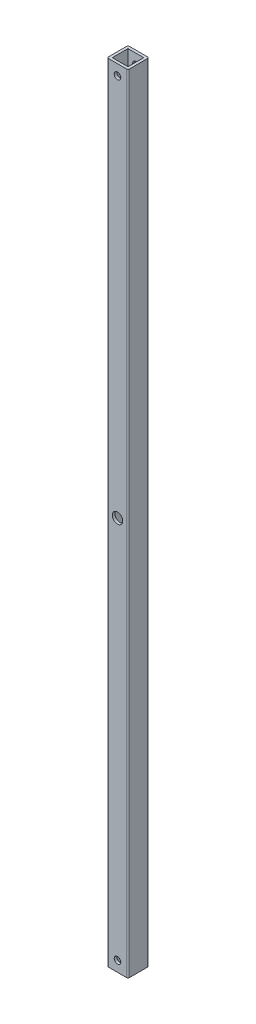
ISO-10303-21;
HEADER;
FILE_DESCRIPTION(('STEP AP214'),'2;1');
FILE_NAME('part.step','',(''),(''),'','','');
FILE_SCHEMA(('AUTOMOTIVE_DESIGN { 1 0 10303 214 1 1 1 1 }'));
ENDSEC;
DATA;
#1=APPLICATION_CONTEXT('core data for automotive mechanical design processes');
#2=APPLICATION_PROTOCOL_DEFINITION('international standard','automotive_design',2000,#1);
#3=PRODUCT_CONTEXT('',#1,'mechanical');
#4=PRODUCT('Part','Part','',(#3));
#5=PRODUCT_RELATED_PRODUCT_CATEGORY('part','',(#4));
#6=PRODUCT_DEFINITION_FORMATION('','',#4);
#7=PRODUCT_DEFINITION_CONTEXT('part definition',#1,'design');
#8=PRODUCT_DEFINITION('design','',#6,#7);
#9=PRODUCT_DEFINITION_SHAPE('','',#8);
#10=(LENGTH_UNIT() NAMED_UNIT(*) SI_UNIT(.MILLI.,.METRE.));
#11=(NAMED_UNIT(*) PLANE_ANGLE_UNIT() SI_UNIT($,.RADIAN.));
#12=(NAMED_UNIT(*) SI_UNIT($,.STERADIAN.) SOLID_ANGLE_UNIT());
#13=UNCERTAINTY_MEASURE_WITH_UNIT(LENGTH_MEASURE(1.E-05),#10,'distance_accuracy_value','');
#14=(GEOMETRIC_REPRESENTATION_CONTEXT(3) GLOBAL_UNCERTAINTY_ASSIGNED_CONTEXT((#13)) GLOBAL_UNIT_ASSIGNED_CONTEXT((#10,
#11,#12)) REPRESENTATION_CONTEXT('',''));
#15=CARTESIAN_POINT('',(0.,0.,0.));
#16=DIRECTION('',(0.,0.,1.));
#17=DIRECTION('',(1.,0.,0.));
#18=AXIS2_PLACEMENT_3D('',#15,#16,#17);
#19=CARTESIAN_POINT('',(0.,600.,0.));
#20=DIRECTION('',(0.,1.,0.));
#21=DIRECTION('',(0.,0.,1.));
#22=AXIS2_PLACEMENT_3D('',#19,#20,#21);
#23=PLANE('',#22);
#24=DIRECTION('',(0.,0.,-1.));
#25=VECTOR('',#24,1.);
#26=CARTESIAN_POINT('',(9.86111111111111,600.,-4.08333333333333));
#27=LINE('',#26,#25);
#28=CARTESIAN_POINT('',(9.86111111111112,600.,10.9166666666667));
#29=VERTEX_POINT('',#28);
#30=CARTESIAN_POINT('',(9.86111111111111,600.,-3.08333333333333));
#31=VERTEX_POINT('',#30);
#32=EDGE_CURVE('E188',#29,#31,#27,.T.);
#33=ORIENTED_EDGE('',*,*,#32,.T.);
#34=CARTESIAN_POINT('',(8.86111111111111,600.,-3.08333333333333));
#35=DIRECTION('',(0.,1.,0.));
#36=DIRECTION('',(0.,0.,1.));
#37=AXIS2_PLACEMENT_3D('',#34,#35,#36);
#38=CIRCLE('',#37,1.);
#39=CARTESIAN_POINT('',(8.86111111111111,600.,-4.08333333333333));
#40=VERTEX_POINT('',#39);
#41=EDGE_CURVE('E226',#31,#40,#38,.T.);
#42=ORIENTED_EDGE('',*,*,#41,.T.);
#43=DIRECTION('',(-1.,0.,0.));
#44=VECTOR('',#43,1.);
#45=CARTESIAN_POINT('',(-6.13888888888889,600.,-4.08333333333333));
#46=LINE('',#45,#44);
#47=CARTESIAN_POINT('',(-5.13888888888889,600.,-4.08333333333333));
#48=VERTEX_POINT('',#47);
#49=EDGE_CURVE('E191',#40,#48,#46,.T.);
#50=ORIENTED_EDGE('',*,*,#49,.T.);
#51=CARTESIAN_POINT('',(-5.13888888888889,600.,-3.08333333333333));
#52=DIRECTION('',(0.,1.,0.));
#53=DIRECTION('',(0.,0.,1.));
#54=AXIS2_PLACEMENT_3D('',#51,#52,#53);
#55=CIRCLE('',#54,1.);
#56=CARTESIAN_POINT('',(-6.13888888888889,600.,-3.08333333333333));
#57=VERTEX_POINT('',#56);
#58=EDGE_CURVE('E224',#48,#57,#55,.T.);
#59=ORIENTED_EDGE('',*,*,#58,.T.);
#60=DIRECTION('',(0.,0.,1.));
#61=VECTOR('',#60,1.);
#62=CARTESIAN_POINT('',(-6.13888888888889,600.,-4.08333333333333));
#63=LINE('',#62,#61);
#64=CARTESIAN_POINT('',(-6.13888888888889,600.,10.9166666666667));
#65=VERTEX_POINT('',#64);
#66=EDGE_CURVE('E183',#57,#65,#63,.T.);
#67=ORIENTED_EDGE('',*,*,#66,.T.);
#68=CARTESIAN_POINT('',(-5.13888888888889,600.,10.9166666666667));
#69=DIRECTION('',(0.,1.,0.));
#70=DIRECTION('',(0.,0.,1.));
#71=AXIS2_PLACEMENT_3D('',#68,#69,#70);
#72=CIRCLE('',#71,1.);
#73=CARTESIAN_POINT('',(-5.13888888888889,600.,11.9166666666667));
#74=VERTEX_POINT('',#73);
#75=EDGE_CURVE('E70',#65,#74,#72,.T.);
#76=ORIENTED_EDGE('',*,*,#75,.T.);
#77=DIRECTION('',(1.,0.,0.));
#78=VECTOR('',#77,1.);
#79=CARTESIAN_POINT('',(-6.13888888888889,600.,11.9166666666667));
#80=LINE('',#79,#78);
#81=CARTESIAN_POINT('',(8.86111111111111,600.,11.9166666666667));
#82=VERTEX_POINT('',#81);
#83=EDGE_CURVE('E185',#74,#82,#80,.T.);
#84=ORIENTED_EDGE('',*,*,#83,.T.);
#85=CARTESIAN_POINT('',(8.86111111111111,600.,10.9166666666667));
#86=DIRECTION('',(0.,1.,0.));
#87=DIRECTION('',(0.,0.,1.));
#88=AXIS2_PLACEMENT_3D('',#85,#86,#87);
#89=CIRCLE('',#88,1.);
#90=EDGE_CURVE('E221',#82,#29,#89,.T.);
#91=ORIENTED_EDGE('',*,*,#90,.T.);
#92=EDGE_LOOP('',(#33,#42,#50,#59,#67,#76,#84,#91));
#93=FACE_BOUND('',#92,.T.);
#94=DIRECTION('',(0.,0.,1.));
#95=VECTOR('',#94,1.);
#96=CARTESIAN_POINT('',(-4.13888888888889,600.,-2.08333333333333));
#97=LINE('',#96,#95);
#98=CARTESIAN_POINT('',(-4.13888888888889,600.,-2.08333333333333));
#99=VERTEX_POINT('',#98);
#100=CARTESIAN_POINT('',(-4.13888888888889,600.,9.91666666666667));
#101=VERTEX_POINT('',#100);
#102=EDGE_CURVE('E150',#99,#101,#97,.T.);
#103=ORIENTED_EDGE('',*,*,#102,.F.);
#104=DIRECTION('',(-1.,0.,0.));
#105=VECTOR('',#104,1.);
#106=CARTESIAN_POINT('',(-4.13888888888889,600.,-2.08333333333333));
#107=LINE('',#106,#105);
#108=CARTESIAN_POINT('',(7.86111111111111,600.,-2.08333333333333));
#109=VERTEX_POINT('',#108);
#110=EDGE_CURVE('E140',#109,#99,#107,.T.);
#111=ORIENTED_EDGE('',*,*,#110,.F.);
#112=DIRECTION('',(0.,0.,-1.));
#113=VECTOR('',#112,1.);
#114=CARTESIAN_POINT('',(7.86111111111111,600.,-2.08333333333333));
#115=LINE('',#114,#113);
#116=CARTESIAN_POINT('',(7.86111111111111,600.,9.91666666666667));
#117=VERTEX_POINT('',#116);
#118=EDGE_CURVE('E165',#117,#109,#115,.T.);
#119=ORIENTED_EDGE('',*,*,#118,.F.);
#120=DIRECTION('',(1.,0.,0.));
#121=VECTOR('',#120,1.);
#122=CARTESIAN_POINT('',(-4.13888888888889,600.,9.91666666666667));
#123=LINE('',#122,#121);
#124=EDGE_CURVE('E163',#101,#117,#123,.T.);
#125=ORIENTED_EDGE('',*,*,#124,.F.);
#126=EDGE_LOOP('',(#103,#111,#119,#125));
#127=FACE_BOUND('',#126,.T.);
#128=ADVANCED_FACE('F47',(#93,#127),#23,.T.);
#129=CARTESIAN_POINT('',(0.,0.,0.));
#130=DIRECTION('',(0.,1.,0.));
#131=DIRECTION('',(0.,0.,1.));
#132=AXIS2_PLACEMENT_3D('',#129,#130,#131);
#133=PLANE('',#132);
#134=DIRECTION('',(-1.,0.,0.));
#135=VECTOR('',#134,1.);
#136=CARTESIAN_POINT('',(-6.13888888888889,0.,-4.08333333333333));
#137=LINE('',#136,#135);
#138=CARTESIAN_POINT('',(8.86111111111111,0.,-4.08333333333333));
#139=VERTEX_POINT('',#138);
#140=CARTESIAN_POINT('',(-5.13888888888889,0.,-4.08333333333333));
#141=VERTEX_POINT('',#140);
#142=EDGE_CURVE('E186',#139,#141,#137,.T.);
#143=ORIENTED_EDGE('',*,*,#142,.F.);
#144=CARTESIAN_POINT('',(8.86111111111111,0.,-3.08333333333333));
#145=DIRECTION('',(0.,1.,0.));
#146=DIRECTION('',(0.,0.,1.));
#147=AXIS2_PLACEMENT_3D('',#144,#145,#146);
#148=CIRCLE('',#147,1.);
#149=CARTESIAN_POINT('',(9.86111111111111,0.,-3.08333333333333));
#150=VERTEX_POINT('',#149);
#151=EDGE_CURVE('E214',#139,#150,#148,.F.);
#152=ORIENTED_EDGE('',*,*,#151,.T.);
#153=DIRECTION('',(0.,0.,-1.));
#154=VECTOR('',#153,1.);
#155=CARTESIAN_POINT('',(9.86111111111111,0.,-4.08333333333333));
#156=LINE('',#155,#154);
#157=CARTESIAN_POINT('',(9.86111111111112,0.,10.9166666666667));
#158=VERTEX_POINT('',#157);
#159=EDGE_CURVE('E199',#158,#150,#156,.T.);
#160=ORIENTED_EDGE('',*,*,#159,.F.);
#161=CARTESIAN_POINT('',(8.86111111111111,0.,10.9166666666667));
#162=DIRECTION('',(0.,1.,0.));
#163=DIRECTION('',(0.,0.,1.));
#164=AXIS2_PLACEMENT_3D('',#161,#162,#163);
#165=CIRCLE('',#164,1.);
#166=CARTESIAN_POINT('',(8.86111111111111,0.,11.9166666666667));
#167=VERTEX_POINT('',#166);
#168=EDGE_CURVE('E208',#158,#167,#165,.F.);
#169=ORIENTED_EDGE('',*,*,#168,.T.);
#170=DIRECTION('',(1.,0.,0.));
#171=VECTOR('',#170,1.);
#172=CARTESIAN_POINT('',(-6.13888888888889,0.,11.9166666666667));
#173=LINE('',#172,#171);
#174=CARTESIAN_POINT('',(-5.13888888888889,0.,11.9166666666667));
#175=VERTEX_POINT('',#174);
#176=EDGE_CURVE('E197',#175,#167,#173,.T.);
#177=ORIENTED_EDGE('',*,*,#176,.F.);
#178=CARTESIAN_POINT('',(-5.13888888888889,0.,10.9166666666667));
#179=DIRECTION('',(0.,1.,0.));
#180=DIRECTION('',(0.,0.,1.));
#181=AXIS2_PLACEMENT_3D('',#178,#179,#180);
#182=CIRCLE('',#181,1.);
#183=CARTESIAN_POINT('',(-6.13888888888889,0.,10.9166666666667));
#184=VERTEX_POINT('',#183);
#185=EDGE_CURVE('E210',#175,#184,#182,.F.);
#186=ORIENTED_EDGE('',*,*,#185,.T.);
#187=DIRECTION('',(0.,0.,1.));
#188=VECTOR('',#187,1.);
#189=CARTESIAN_POINT('',(-6.13888888888889,0.,-4.08333333333333));
#190=LINE('',#189,#188);
#191=CARTESIAN_POINT('',(-6.13888888888889,0.,-3.08333333333333));
#192=VERTEX_POINT('',#191);
#193=EDGE_CURVE('E158',#192,#184,#190,.T.);
#194=ORIENTED_EDGE('',*,*,#193,.F.);
#195=CARTESIAN_POINT('',(-5.13888888888889,0.,-3.08333333333333));
#196=DIRECTION('',(0.,1.,0.));
#197=DIRECTION('',(0.,0.,1.));
#198=AXIS2_PLACEMENT_3D('',#195,#196,#197);
#199=CIRCLE('',#198,1.);
#200=EDGE_CURVE('E212',#192,#141,#199,.F.);
#201=ORIENTED_EDGE('',*,*,#200,.T.);
#202=EDGE_LOOP('',(#143,#152,#160,#169,#177,#186,#194,#201));
#203=FACE_BOUND('',#202,.T.);
#204=DIRECTION('',(-1.,0.,0.));
#205=VECTOR('',#204,1.);
#206=CARTESIAN_POINT('',(-4.13888888888889,0.,-2.08333333333333));
#207=LINE('',#206,#205);
#208=CARTESIAN_POINT('',(7.86111111111111,0.,-2.08333333333333));
#209=VERTEX_POINT('',#208);
#210=CARTESIAN_POINT('',(-4.13888888888889,0.,-2.08333333333333));
#211=VERTEX_POINT('',#210);
#212=EDGE_CURVE('E170',#209,#211,#207,.T.);
#213=ORIENTED_EDGE('',*,*,#212,.T.);
#214=DIRECTION('',(0.,0.,1.));
#215=VECTOR('',#214,1.);
#216=CARTESIAN_POINT('',(-4.13888888888889,0.,-2.08333333333333));
#217=LINE('',#216,#215);
#218=CARTESIAN_POINT('',(-4.13888888888889,0.,9.91666666666667));
#219=VERTEX_POINT('',#218);
#220=EDGE_CURVE('E157',#211,#219,#217,.T.);
#221=ORIENTED_EDGE('',*,*,#220,.T.);
#222=DIRECTION('',(1.,0.,0.));
#223=VECTOR('',#222,1.);
#224=CARTESIAN_POINT('',(-4.13888888888889,0.,9.91666666666667));
#225=LINE('',#224,#223);
#226=CARTESIAN_POINT('',(7.86111111111111,0.,9.91666666666667));
#227=VERTEX_POINT('',#226);
#228=EDGE_CURVE('E174',#219,#227,#225,.T.);
#229=ORIENTED_EDGE('',*,*,#228,.T.);
#230=DIRECTION('',(0.,0.,-1.));
#231=VECTOR('',#230,1.);
#232=CARTESIAN_POINT('',(7.86111111111111,0.,-2.08333333333333));
#233=LINE('',#232,#231);
#234=EDGE_CURVE('E151',#227,#209,#233,.T.);
#235=ORIENTED_EDGE('',*,*,#234,.T.);
#236=EDGE_LOOP('',(#213,#221,#229,#235));
#237=FACE_BOUND('',#236,.T.);
#238=ADVANCED_FACE('F272',(#203,#237),#133,.F.);
#239=CARTESIAN_POINT('',(-6.13888888888889,600.,-4.08333333333333));
#240=DIRECTION('',(1.,0.,0.));
#241=DIRECTION('',(0.,0.,-1.));
#242=AXIS2_PLACEMENT_3D('',#239,#240,#241);
#243=PLANE('',#242);
#244=ORIENTED_EDGE('',*,*,#66,.F.);
#245=DIRECTION('',(0.,-1.,0.));
#246=VECTOR('',#245,1.);
#247=CARTESIAN_POINT('',(-6.13888888888889,600.,-3.08333333333333));
#248=LINE('',#247,#246);
#249=EDGE_CURVE('E230',#57,#192,#248,.T.);
#250=ORIENTED_EDGE('',*,*,#249,.T.);
#251=ORIENTED_EDGE('',*,*,#193,.T.);
#252=DIRECTION('',(0.,-1.,0.));
#253=VECTOR('',#252,1.);
#254=CARTESIAN_POINT('',(-6.13888888888889,600.,10.9166666666667));
#255=LINE('',#254,#253);
#256=EDGE_CURVE('E228',#184,#65,#255,.F.);
#257=ORIENTED_EDGE('',*,*,#256,.T.);
#258=EDGE_LOOP('',(#244,#250,#251,#257));
#259=FACE_BOUND('',#258,.T.);
#260=ADVANCED_FACE('F289',(#259),#243,.F.);
#261=CARTESIAN_POINT('',(-6.13888888888889,600.,11.9166666666667));
#262=DIRECTION('',(0.,0.,-1.));
#263=DIRECTION('',(-1.,0.,0.));
#264=AXIS2_PLACEMENT_3D('',#261,#262,#263);
#265=PLANE('',#264);
#266=CARTESIAN_POINT('',(1.86111111111111,8.,11.9166666666667));
#267=DIRECTION('',(0.,0.,-1.));
#268=DIRECTION('',(-1.,0.,0.));
#269=AXIS2_PLACEMENT_3D('',#266,#267,#268);
#270=CIRCLE('',#269,2.5);
#271=CARTESIAN_POINT('',(-0.638888888888889,8.,11.9166666666667));
#272=VERTEX_POINT('',#271);
#273=EDGE_CURVE('E237',#272,#272,#270,.T.);
#274=ORIENTED_EDGE('',*,*,#273,.T.);
#275=EDGE_LOOP('',(#274));
#276=FACE_BOUND('',#275,.T.);
#277=CARTESIAN_POINT('',(1.86111111111111,592.,11.9166666666667));
#278=DIRECTION('',(0.,0.,-1.));
#279=DIRECTION('',(-1.,0.,0.));
#280=AXIS2_PLACEMENT_3D('',#277,#278,#279);
#281=CIRCLE('',#280,2.5);
#282=CARTESIAN_POINT('',(-0.638888888888891,592.,11.9166666666667));
#283=VERTEX_POINT('',#282);
#284=EDGE_CURVE('E363',#283,#283,#281,.T.);
#285=ORIENTED_EDGE('',*,*,#284,.T.);
#286=EDGE_LOOP('',(#285));
#287=FACE_BOUND('',#286,.T.);
#288=CARTESIAN_POINT('',(1.86111111111111,300.,11.9166666666667));
#289=DIRECTION('',(0.,0.,-1.));
#290=DIRECTION('',(-1.,0.,0.));
#291=AXIS2_PLACEMENT_3D('',#288,#289,#290);
#292=CIRCLE('',#291,4.);
#293=CARTESIAN_POINT('',(-2.13888888888889,300.,11.9166666666667));
#294=VERTEX_POINT('',#293);
#295=EDGE_CURVE('E250',#294,#294,#292,.T.);
#296=ORIENTED_EDGE('',*,*,#295,.T.);
#297=EDGE_LOOP('',(#296));
#298=FACE_BOUND('',#297,.T.);
#299=ORIENTED_EDGE('',*,*,#83,.F.);
#300=DIRECTION('',(0.,-1.,0.));
#301=VECTOR('',#300,1.);
#302=CARTESIAN_POINT('',(-5.13888888888889,600.,11.9166666666667));
#303=LINE('',#302,#301);
#304=EDGE_CURVE('E11',#74,#175,#303,.T.);
#305=ORIENTED_EDGE('',*,*,#304,.T.);
#306=ORIENTED_EDGE('',*,*,#176,.T.);
#307=DIRECTION('',(0.,-1.,0.));
#308=VECTOR('',#307,1.);
#309=CARTESIAN_POINT('',(8.86111111111111,600.,11.9166666666667));
#310=LINE('',#309,#308);
#311=EDGE_CURVE('E56',#167,#82,#310,.F.);
#312=ORIENTED_EDGE('',*,*,#311,.T.);
#313=EDGE_LOOP('',(#299,#305,#306,#312));
#314=FACE_BOUND('',#313,.T.);
#315=ADVANCED_FACE('F302',(#276,#287,#298,#314),#265,.F.);
#316=CARTESIAN_POINT('',(9.86111111111111,600.,-4.08333333333333));
#317=DIRECTION('',(-1.,0.,0.));
#318=DIRECTION('',(0.,0.,1.));
#319=AXIS2_PLACEMENT_3D('',#316,#317,#318);
#320=PLANE('',#319);
#321=ORIENTED_EDGE('',*,*,#159,.T.);
#322=DIRECTION('',(0.,-1.,0.));
#323=VECTOR('',#322,1.);
#324=CARTESIAN_POINT('',(9.86111111111111,600.,-3.08333333333333));
#325=LINE('',#324,#323);
#326=EDGE_CURVE('E219',#150,#31,#325,.F.);
#327=ORIENTED_EDGE('',*,*,#326,.T.);
#328=ORIENTED_EDGE('',*,*,#32,.F.);
#329=DIRECTION('',(0.,-1.,0.));
#330=VECTOR('',#329,1.);
#331=CARTESIAN_POINT('',(9.86111111111112,600.,10.9166666666667));
#332=LINE('',#331,#330);
#333=EDGE_CURVE('E216',#29,#158,#332,.T.);
#334=ORIENTED_EDGE('',*,*,#333,.T.);
#335=EDGE_LOOP('',(#321,#327,#328,#334));
#336=FACE_BOUND('',#335,.T.);
#337=ADVANCED_FACE('F298',(#336),#320,.F.);
#338=CARTESIAN_POINT('',(-6.13888888888889,600.,-4.08333333333333));
#339=DIRECTION('',(0.,0.,1.));
#340=DIRECTION('',(1.,0.,0.));
#341=AXIS2_PLACEMENT_3D('',#338,#339,#340);
#342=PLANE('',#341);
#343=CARTESIAN_POINT('',(1.86111111111111,8.,-4.08333333333333));
#344=DIRECTION('',(0.,0.,-1.));
#345=DIRECTION('',(-1.,0.,0.));
#346=AXIS2_PLACEMENT_3D('',#343,#344,#345);
#347=CIRCLE('',#346,2.5);
#348=CARTESIAN_POINT('',(-0.638888888888889,8.,-4.08333333333333));
#349=VERTEX_POINT('',#348);
#350=EDGE_CURVE('E371',#349,#349,#347,.T.);
#351=ORIENTED_EDGE('',*,*,#350,.F.);
#352=EDGE_LOOP('',(#351));
#353=FACE_BOUND('',#352,.T.);
#354=CARTESIAN_POINT('',(1.86111111111111,592.,-4.08333333333333));
#355=DIRECTION('',(0.,0.,-1.));
#356=DIRECTION('',(-1.,0.,0.));
#357=AXIS2_PLACEMENT_3D('',#354,#355,#356);
#358=CIRCLE('',#357,2.5);
#359=CARTESIAN_POINT('',(-0.638888888888891,592.,-4.08333333333333));
#360=VERTEX_POINT('',#359);
#361=EDGE_CURVE('E365',#360,#360,#358,.T.);
#362=ORIENTED_EDGE('',*,*,#361,.F.);
#363=EDGE_LOOP('',(#362));
#364=FACE_BOUND('',#363,.T.);
#365=CARTESIAN_POINT('',(1.86111111111111,300.,-4.08333333333333));
#366=DIRECTION('',(0.,0.,-1.));
#367=DIRECTION('',(-1.,0.,0.));
#368=AXIS2_PLACEMENT_3D('',#365,#366,#367);
#369=CIRCLE('',#368,4.);
#370=CARTESIAN_POINT('',(-2.13888888888889,300.,-4.08333333333333));
#371=VERTEX_POINT('',#370);
#372=EDGE_CURVE('E361',#371,#371,#369,.T.);
#373=ORIENTED_EDGE('',*,*,#372,.F.);
#374=EDGE_LOOP('',(#373));
#375=FACE_BOUND('',#374,.T.);
#376=ORIENTED_EDGE('',*,*,#49,.F.);
#377=DIRECTION('',(0.,-1.,0.));
#378=VECTOR('',#377,1.);
#379=CARTESIAN_POINT('',(8.86111111111111,600.,-4.08333333333333));
#380=LINE('',#379,#378);
#381=EDGE_CURVE('E205',#40,#139,#380,.T.);
#382=ORIENTED_EDGE('',*,*,#381,.T.);
#383=ORIENTED_EDGE('',*,*,#142,.T.);
#384=DIRECTION('',(0.,-1.,0.));
#385=VECTOR('',#384,1.);
#386=CARTESIAN_POINT('',(-5.13888888888889,600.,-4.08333333333333));
#387=LINE('',#386,#385);
#388=EDGE_CURVE('E194',#141,#48,#387,.F.);
#389=ORIENTED_EDGE('',*,*,#388,.T.);
#390=EDGE_LOOP('',(#376,#382,#383,#389));
#391=FACE_BOUND('',#390,.T.);
#392=ADVANCED_FACE('F295',(#353,#364,#375,#391),#342,.F.);
#393=CARTESIAN_POINT('',(-4.13888888888889,600.,-2.08333333333333));
#394=DIRECTION('',(0.,0.,1.));
#395=DIRECTION('',(1.,0.,0.));
#396=AXIS2_PLACEMENT_3D('',#393,#394,#395);
#397=PLANE('',#396);
#398=CARTESIAN_POINT('',(1.86111111111111,8.,-2.08333333333333));
#399=DIRECTION('',(0.,0.,1.));
#400=DIRECTION('',(1.,0.,0.));
#401=AXIS2_PLACEMENT_3D('',#398,#399,#400);
#402=CIRCLE('',#401,2.5);
#403=CARTESIAN_POINT('',(4.36111111111111,8.,-2.08333333333333));
#404=VERTEX_POINT('',#403);
#405=EDGE_CURVE('E172',#404,#404,#402,.T.);
#406=ORIENTED_EDGE('',*,*,#405,.F.);
#407=EDGE_LOOP('',(#406));
#408=FACE_BOUND('',#407,.T.);
#409=CARTESIAN_POINT('',(1.86111111111111,592.,-2.08333333333333));
#410=DIRECTION('',(0.,0.,1.));
#411=DIRECTION('',(1.,0.,0.));
#412=AXIS2_PLACEMENT_3D('',#409,#410,#411);
#413=CIRCLE('',#412,2.5);
#414=CARTESIAN_POINT('',(4.36111111111111,592.,-2.08333333333333));
#415=VERTEX_POINT('',#414);
#416=EDGE_CURVE('E240',#415,#415,#413,.T.);
#417=ORIENTED_EDGE('',*,*,#416,.F.);
#418=EDGE_LOOP('',(#417));
#419=FACE_BOUND('',#418,.T.);
#420=CARTESIAN_POINT('',(1.86111111111111,300.,-2.08333333333333));
#421=DIRECTION('',(0.,0.,1.));
#422=DIRECTION('',(1.,0.,0.));
#423=AXIS2_PLACEMENT_3D('',#420,#421,#422);
#424=CIRCLE('',#423,4.);
#425=CARTESIAN_POINT('',(5.86111111111111,300.,-2.08333333333333));
#426=VERTEX_POINT('',#425);
#427=EDGE_CURVE('E236',#426,#426,#424,.T.);
#428=ORIENTED_EDGE('',*,*,#427,.F.);
#429=EDGE_LOOP('',(#428));
#430=FACE_BOUND('',#429,.T.);
#431=ORIENTED_EDGE('',*,*,#212,.F.);
#432=DIRECTION('',(0.,-1.,0.));
#433=VECTOR('',#432,1.);
#434=CARTESIAN_POINT('',(7.86111111111111,600.,-2.08333333333333));
#435=LINE('',#434,#433);
#436=EDGE_CURVE('E146',#109,#209,#435,.T.);
#437=ORIENTED_EDGE('',*,*,#436,.F.);
#438=ORIENTED_EDGE('',*,*,#110,.T.);
#439=DIRECTION('',(0.,-1.,0.));
#440=VECTOR('',#439,1.);
#441=CARTESIAN_POINT('',(-4.13888888888889,600.,-2.08333333333333));
#442=LINE('',#441,#440);
#443=EDGE_CURVE('E143',#99,#211,#442,.T.);
#444=ORIENTED_EDGE('',*,*,#443,.T.);
#445=EDGE_LOOP('',(#431,#437,#438,#444));
#446=FACE_BOUND('',#445,.T.);
#447=ADVANCED_FACE('F142',(#408,#419,#430,#446),#397,.T.);
#448=CARTESIAN_POINT('',(-4.13888888888889,600.,-2.08333333333333));
#449=DIRECTION('',(1.,0.,0.));
#450=DIRECTION('',(0.,0.,-1.));
#451=AXIS2_PLACEMENT_3D('',#448,#449,#450);
#452=PLANE('',#451);
#453=ORIENTED_EDGE('',*,*,#220,.F.);
#454=ORIENTED_EDGE('',*,*,#443,.F.);
#455=ORIENTED_EDGE('',*,*,#102,.T.);
#456=DIRECTION('',(0.,-1.,0.));
#457=VECTOR('',#456,1.);
#458=CARTESIAN_POINT('',(-4.13888888888889,600.,9.91666666666667));
#459=LINE('',#458,#457);
#460=EDGE_CURVE('E159',#101,#219,#459,.T.);
#461=ORIENTED_EDGE('',*,*,#460,.T.);
#462=EDGE_LOOP('',(#453,#454,#455,#461));
#463=FACE_BOUND('',#462,.T.);
#464=ADVANCED_FACE('F154',(#463),#452,.T.);
#465=CARTESIAN_POINT('',(-4.13888888888889,600.,9.91666666666667));
#466=DIRECTION('',(0.,0.,-1.));
#467=DIRECTION('',(-1.,0.,0.));
#468=AXIS2_PLACEMENT_3D('',#465,#466,#467);
#469=PLANE('',#468);
#470=CARTESIAN_POINT('',(1.86111111111111,8.,9.91666666666667));
#471=DIRECTION('',(0.,0.,-1.));
#472=DIRECTION('',(-1.,0.,0.));
#473=AXIS2_PLACEMENT_3D('',#470,#471,#472);
#474=CIRCLE('',#473,2.5);
#475=CARTESIAN_POINT('',(-0.638888888888889,8.,9.91666666666667));
#476=VERTEX_POINT('',#475);
#477=EDGE_CURVE('E51',#476,#476,#474,.T.);
#478=ORIENTED_EDGE('',*,*,#477,.F.);
#479=EDGE_LOOP('',(#478));
#480=FACE_BOUND('',#479,.T.);
#481=CARTESIAN_POINT('',(1.86111111111111,592.,9.91666666666667));
#482=DIRECTION('',(0.,0.,-1.));
#483=DIRECTION('',(-1.,0.,0.));
#484=AXIS2_PLACEMENT_3D('',#481,#482,#483);
#485=CIRCLE('',#484,2.5);
#486=CARTESIAN_POINT('',(-0.638888888888891,592.,9.91666666666667));
#487=VERTEX_POINT('',#486);
#488=EDGE_CURVE('E238',#487,#487,#485,.T.);
#489=ORIENTED_EDGE('',*,*,#488,.F.);
#490=EDGE_LOOP('',(#489));
#491=FACE_BOUND('',#490,.T.);
#492=CARTESIAN_POINT('',(1.86111111111111,300.,9.91666666666667));
#493=DIRECTION('',(0.,0.,-1.));
#494=DIRECTION('',(-1.,0.,0.));
#495=AXIS2_PLACEMENT_3D('',#492,#493,#494);
#496=CIRCLE('',#495,4.);
#497=CARTESIAN_POINT('',(-2.13888888888889,300.,9.91666666666667));
#498=VERTEX_POINT('',#497);
#499=EDGE_CURVE('E234',#498,#498,#496,.T.);
#500=ORIENTED_EDGE('',*,*,#499,.F.);
#501=EDGE_LOOP('',(#500));
#502=FACE_BOUND('',#501,.T.);
#503=ORIENTED_EDGE('',*,*,#228,.F.);
#504=ORIENTED_EDGE('',*,*,#460,.F.);
#505=ORIENTED_EDGE('',*,*,#124,.T.);
#506=DIRECTION('',(0.,-1.,0.));
#507=VECTOR('',#506,1.);
#508=CARTESIAN_POINT('',(7.86111111111111,600.,9.91666666666667));
#509=LINE('',#508,#507);
#510=EDGE_CURVE('E180',#117,#227,#509,.T.);
#511=ORIENTED_EDGE('',*,*,#510,.T.);
#512=EDGE_LOOP('',(#503,#504,#505,#511));
#513=FACE_BOUND('',#512,.T.);
#514=ADVANCED_FACE('F261',(#480,#491,#502,#513),#469,.T.);
#515=CARTESIAN_POINT('',(7.86111111111111,600.,-2.08333333333333));
#516=DIRECTION('',(-1.,0.,0.));
#517=DIRECTION('',(0.,0.,1.));
#518=AXIS2_PLACEMENT_3D('',#515,#516,#517);
#519=PLANE('',#518);
#520=ORIENTED_EDGE('',*,*,#234,.F.);
#521=ORIENTED_EDGE('',*,*,#510,.F.);
#522=ORIENTED_EDGE('',*,*,#118,.T.);
#523=ORIENTED_EDGE('',*,*,#436,.T.);
#524=EDGE_LOOP('',(#520,#521,#522,#523));
#525=FACE_BOUND('',#524,.T.);
#526=ADVANCED_FACE('F264',(#525),#519,.T.);
#527=CARTESIAN_POINT('',(8.86111111111111,600.,-3.08333333333333));
#528=DIRECTION('',(0.,-1.,0.));
#529=DIRECTION('',(0.,0.,-1.));
#530=AXIS2_PLACEMENT_3D('',#527,#528,#529);
#531=CYLINDRICAL_SURFACE('',#530,1.);
#532=ORIENTED_EDGE('',*,*,#41,.F.);
#533=ORIENTED_EDGE('',*,*,#326,.F.);
#534=ORIENTED_EDGE('',*,*,#151,.F.);
#535=ORIENTED_EDGE('',*,*,#381,.F.);
#536=EDGE_LOOP('',(#532,#533,#534,#535));
#537=FACE_BOUND('',#536,.T.);
#538=ADVANCED_FACE('F275',(#537),#531,.T.);
#539=CARTESIAN_POINT('',(-5.13888888888889,600.,-3.08333333333333));
#540=DIRECTION('',(0.,-1.,0.));
#541=DIRECTION('',(0.,0.,-1.));
#542=AXIS2_PLACEMENT_3D('',#539,#540,#541);
#543=CYLINDRICAL_SURFACE('',#542,1.);
#544=ORIENTED_EDGE('',*,*,#58,.F.);
#545=ORIENTED_EDGE('',*,*,#388,.F.);
#546=ORIENTED_EDGE('',*,*,#200,.F.);
#547=ORIENTED_EDGE('',*,*,#249,.F.);
#548=EDGE_LOOP('',(#544,#545,#546,#547));
#549=FACE_BOUND('',#548,.T.);
#550=ADVANCED_FACE('F280',(#549),#543,.T.);
#551=CARTESIAN_POINT('',(-5.13888888888889,600.,10.9166666666667));
#552=DIRECTION('',(0.,-1.,0.));
#553=DIRECTION('',(0.,0.,-1.));
#554=AXIS2_PLACEMENT_3D('',#551,#552,#553);
#555=CYLINDRICAL_SURFACE('',#554,1.);
#556=ORIENTED_EDGE('',*,*,#75,.F.);
#557=ORIENTED_EDGE('',*,*,#256,.F.);
#558=ORIENTED_EDGE('',*,*,#185,.F.);
#559=ORIENTED_EDGE('',*,*,#304,.F.);
#560=EDGE_LOOP('',(#556,#557,#558,#559));
#561=FACE_BOUND('',#560,.T.);
#562=ADVANCED_FACE('F311',(#561),#555,.T.);
#563=CARTESIAN_POINT('',(8.86111111111111,600.,10.9166666666667));
#564=DIRECTION('',(0.,-1.,0.));
#565=DIRECTION('',(0.,0.,-1.));
#566=AXIS2_PLACEMENT_3D('',#563,#564,#565);
#567=CYLINDRICAL_SURFACE('',#566,1.);
#568=ORIENTED_EDGE('',*,*,#90,.F.);
#569=ORIENTED_EDGE('',*,*,#311,.F.);
#570=ORIENTED_EDGE('',*,*,#168,.F.);
#571=ORIENTED_EDGE('',*,*,#333,.F.);
#572=EDGE_LOOP('',(#568,#569,#570,#571));
#573=FACE_BOUND('',#572,.T.);
#574=ADVANCED_FACE('F49',(#573),#567,.T.);
#575=CARTESIAN_POINT('',(1.86111111111111,300.,11.9166666666667));
#576=DIRECTION('',(0.,0.,-1.));
#577=DIRECTION('',(-1.,0.,0.));
#578=AXIS2_PLACEMENT_3D('',#575,#576,#577);
#579=CYLINDRICAL_SURFACE('',#578,4.);
#580=ORIENTED_EDGE('',*,*,#499,.T.);
#581=EDGE_LOOP('',(#580));
#582=FACE_BOUND('',#581,.T.);
#583=ORIENTED_EDGE('',*,*,#295,.F.);
#584=EDGE_LOOP('',(#583));
#585=FACE_BOUND('',#584,.T.);
#586=ADVANCED_FACE('F318',(#582,#585),#579,.F.);
#587=CARTESIAN_POINT('',(1.86111111111111,592.,11.9166666666667));
#588=DIRECTION('',(0.,0.,-1.));
#589=DIRECTION('',(-1.,0.,0.));
#590=AXIS2_PLACEMENT_3D('',#587,#588,#589);
#591=CYLINDRICAL_SURFACE('',#590,2.5);
#592=ORIENTED_EDGE('',*,*,#488,.T.);
#593=EDGE_LOOP('',(#592));
#594=FACE_BOUND('',#593,.T.);
#595=ORIENTED_EDGE('',*,*,#284,.F.);
#596=EDGE_LOOP('',(#595));
#597=FACE_BOUND('',#596,.T.);
#598=ADVANCED_FACE('F341',(#594,#597),#591,.F.);
#599=CARTESIAN_POINT('',(1.86111111111111,8.,11.9166666666667));
#600=DIRECTION('',(0.,0.,-1.));
#601=DIRECTION('',(-1.,0.,0.));
#602=AXIS2_PLACEMENT_3D('',#599,#600,#601);
#603=CYLINDRICAL_SURFACE('',#602,2.5);
#604=ORIENTED_EDGE('',*,*,#477,.T.);
#605=EDGE_LOOP('',(#604));
#606=FACE_BOUND('',#605,.T.);
#607=ORIENTED_EDGE('',*,*,#273,.F.);
#608=EDGE_LOOP('',(#607));
#609=FACE_BOUND('',#608,.T.);
#610=ADVANCED_FACE('F258',(#606,#609),#603,.F.);
#611=ORIENTED_EDGE('',*,*,#427,.T.);
#612=EDGE_LOOP('',(#611));
#613=FACE_BOUND('',#612,.T.);
#614=ORIENTED_EDGE('',*,*,#372,.T.);
#615=EDGE_LOOP('',(#614));
#616=FACE_BOUND('',#615,.T.);
#617=ADVANCED_FACE('F343',(#613,#616),#579,.F.);
#618=ORIENTED_EDGE('',*,*,#416,.T.);
#619=EDGE_LOOP('',(#618));
#620=FACE_BOUND('',#619,.T.);
#621=ORIENTED_EDGE('',*,*,#361,.T.);
#622=EDGE_LOOP('',(#621));
#623=FACE_BOUND('',#622,.T.);
#624=ADVANCED_FACE('F348',(#620,#623),#591,.F.);
#625=ORIENTED_EDGE('',*,*,#405,.T.);
#626=EDGE_LOOP('',(#625));
#627=FACE_BOUND('',#626,.T.);
#628=ORIENTED_EDGE('',*,*,#350,.T.);
#629=EDGE_LOOP('',(#628));
#630=FACE_BOUND('',#629,.T.);
#631=ADVANCED_FACE('F355',(#627,#630),#603,.F.);
#632=CLOSED_SHELL('',(#128,#238,#260,#315,#337,#392,#447,#464,#514,#526,#538,#550,#562,#574,
#586,#598,#610,#617,#624,#631));
#633=MANIFOLD_SOLID_BREP('B2',#632);
#634=ADVANCED_BREP_SHAPE_REPRESENTATION('',(#18,#633),#14);
#635=SHAPE_DEFINITION_REPRESENTATION(#9,#634);
ENDSEC;
END-ISO-10303-21;
